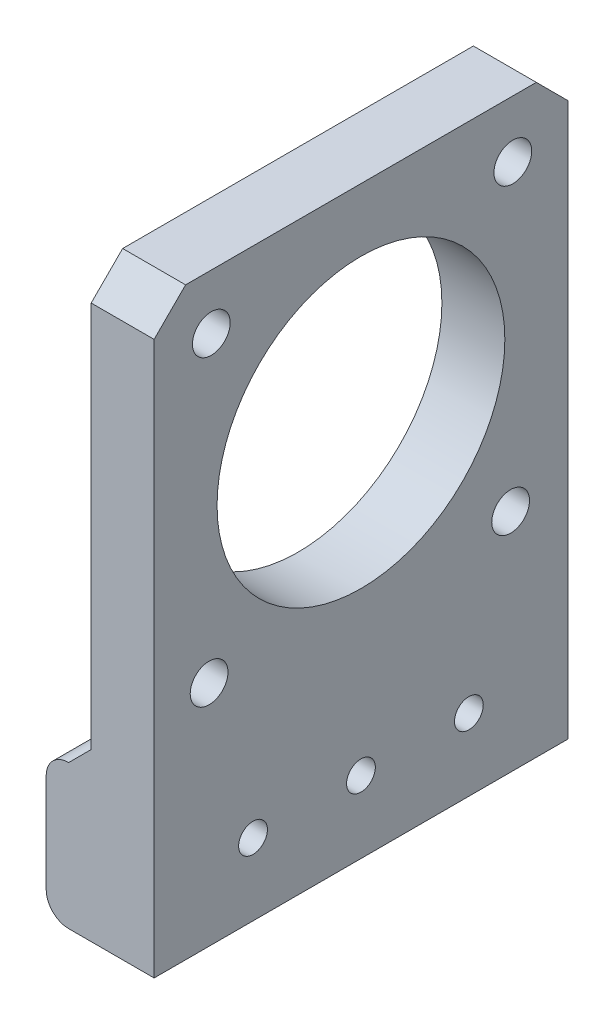
ISO-10303-21;
HEADER;
FILE_DESCRIPTION(('STEP AP214'),'2;1');
FILE_NAME('part.step','',(''),(''),'','','');
FILE_SCHEMA(('AUTOMOTIVE_DESIGN { 1 0 10303 214 1 1 1 1 }'));
ENDSEC;
DATA;
#1=APPLICATION_CONTEXT('core data for automotive mechanical design processes');
#2=APPLICATION_PROTOCOL_DEFINITION('international standard','automotive_design',2000,#1);
#3=PRODUCT_CONTEXT('',#1,'mechanical');
#4=PRODUCT('Part','Part','',(#3));
#5=PRODUCT_RELATED_PRODUCT_CATEGORY('part','',(#4));
#6=PRODUCT_DEFINITION_FORMATION('','',#4);
#7=PRODUCT_DEFINITION_CONTEXT('part definition',#1,'design');
#8=PRODUCT_DEFINITION('design','',#6,#7);
#9=PRODUCT_DEFINITION_SHAPE('','',#8);
#10=(LENGTH_UNIT() NAMED_UNIT(*) SI_UNIT(.MILLI.,.METRE.));
#11=(NAMED_UNIT(*) PLANE_ANGLE_UNIT() SI_UNIT($,.RADIAN.));
#12=(NAMED_UNIT(*) SI_UNIT($,.STERADIAN.) SOLID_ANGLE_UNIT());
#13=UNCERTAINTY_MEASURE_WITH_UNIT(LENGTH_MEASURE(1.E-05),#10,'distance_accuracy_value','');
#14=(GEOMETRIC_REPRESENTATION_CONTEXT(3) GLOBAL_UNCERTAINTY_ASSIGNED_CONTEXT((#13)) GLOBAL_UNIT_ASSIGNED_CONTEXT((#10,
#11,#12)) REPRESENTATION_CONTEXT('',''));
#15=CARTESIAN_POINT('',(0.,0.,0.));
#16=DIRECTION('',(0.,0.,1.));
#17=DIRECTION('',(1.,0.,0.));
#18=AXIS2_PLACEMENT_3D('',#15,#16,#17);
#19=CARTESIAN_POINT('',(-4.99999999999999,2.99999999999996,-23.));
#20=DIRECTION('',(-1.,0.,0.));
#21=DIRECTION('',(0.,0.,1.));
#22=AXIS2_PLACEMENT_3D('',#19,#20,#21);
#23=CYLINDRICAL_SURFACE('',#22,1.59999999999999);
#24=CARTESIAN_POINT('',(-4.99999999999999,2.99999999999996,-23.));
#25=DIRECTION('',(-1.,0.,0.));
#26=DIRECTION('',(0.,0.,1.));
#27=AXIS2_PLACEMENT_3D('',#24,#25,#26);
#28=CIRCLE('',#27,1.6);
#29=CARTESIAN_POINT('',(-4.99999999999999,2.99999999999996,-21.4));
#30=VERTEX_POINT('',#29);
#31=EDGE_CURVE('E148',#30,#30,#28,.T.);
#32=ORIENTED_EDGE('',*,*,#31,.T.);
#33=EDGE_LOOP('',(#32));
#34=FACE_BOUND('',#33,.T.);
#35=CARTESIAN_POINT('',(7.,2.99999999999996,-23.));
#36=DIRECTION('',(1.,0.,0.));
#37=DIRECTION('',(0.,0.,-1.));
#38=AXIS2_PLACEMENT_3D('',#35,#36,#37);
#39=CIRCLE('',#38,1.59999999999999);
#40=CARTESIAN_POINT('',(7.,2.99999999999996,-24.6));
#41=VERTEX_POINT('',#40);
#42=EDGE_CURVE('E12',#41,#41,#39,.F.);
#43=ORIENTED_EDGE('',*,*,#42,.F.);
#44=EDGE_LOOP('',(#43));
#45=FACE_BOUND('',#44,.T.);
#46=ADVANCED_FACE('F38',(#34,#45),#23,.F.);
#47=CARTESIAN_POINT('',(0.,6.,0.));
#48=DIRECTION('',(0.,0.,-1.));
#49=DIRECTION('',(-1.,0.,0.));
#50=AXIS2_PLACEMENT_3D('',#47,#48,#49);
#51=PLANE('',#50);
#52=DIRECTION('',(1.,0.,0.));
#53=VECTOR('',#52,1.);
#54=CARTESIAN_POINT('',(-4.99999999999999,-5.,0.));
#55=LINE('',#54,#53);
#56=CARTESIAN_POINT('',(-2.49999999999999,-5.,0.));
#57=VERTEX_POINT('',#56);
#58=CARTESIAN_POINT('',(7.,-4.99999999999999,0.));
#59=VERTEX_POINT('',#58);
#60=EDGE_CURVE('E145',#57,#59,#55,.T.);
#61=ORIENTED_EDGE('',*,*,#60,.T.);
#62=DIRECTION('',(0.,-1.,0.));
#63=VECTOR('',#62,1.);
#64=CARTESIAN_POINT('',(7.,60.,0.));
#65=LINE('',#64,#63);
#66=CARTESIAN_POINT('',(7.,56.5,0.));
#67=VERTEX_POINT('',#66);
#68=EDGE_CURVE('E55',#67,#59,#65,.T.);
#69=ORIENTED_EDGE('',*,*,#68,.F.);
#70=DIRECTION('',(-1.,0.,0.));
#71=VECTOR('',#70,1.);
#72=CARTESIAN_POINT('',(0.,56.5,0.));
#73=LINE('',#72,#71);
#74=CARTESIAN_POINT('',(0.,56.5,0.));
#75=VERTEX_POINT('',#74);
#76=EDGE_CURVE('E206',#67,#75,#73,.T.);
#77=ORIENTED_EDGE('',*,*,#76,.T.);
#78=DIRECTION('',(0.,-1.,0.));
#79=VECTOR('',#78,1.);
#80=CARTESIAN_POINT('',(0.,6.,0.));
#81=LINE('',#80,#79);
#82=CARTESIAN_POINT('',(0.,13.5,0.));
#83=VERTEX_POINT('',#82);
#84=EDGE_CURVE('E185',#75,#83,#81,.T.);
#85=ORIENTED_EDGE('',*,*,#84,.T.);
#86=DIRECTION('',(-0.707106781186549,-0.707106781186546,0.));
#87=VECTOR('',#86,1.);
#88=CARTESIAN_POINT('',(-3.75,9.75000000000002,0.));
#89=LINE('',#88,#87);
#90=CARTESIAN_POINT('',(-2.5,11.,0.));
#91=VERTEX_POINT('',#90);
#92=EDGE_CURVE('E228',#83,#91,#89,.T.);
#93=ORIENTED_EDGE('',*,*,#92,.T.);
#94=CARTESIAN_POINT('',(-2.5,8.5,0.));
#95=DIRECTION('',(0.,0.,-1.));
#96=DIRECTION('',(-1.,0.,0.));
#97=AXIS2_PLACEMENT_3D('',#94,#95,#96);
#98=CIRCLE('',#97,2.5);
#99=CARTESIAN_POINT('',(-5.,8.5,0.));
#100=VERTEX_POINT('',#99);
#101=EDGE_CURVE('E222',#91,#100,#98,.F.);
#102=ORIENTED_EDGE('',*,*,#101,.T.);
#103=DIRECTION('',(0.,-1.,0.));
#104=VECTOR('',#103,1.);
#105=CARTESIAN_POINT('',(-5.,11.,0.));
#106=LINE('',#105,#104);
#107=CARTESIAN_POINT('',(-4.99999999999999,-2.5,0.));
#108=VERTEX_POINT('',#107);
#109=EDGE_CURVE('E151',#100,#108,#106,.T.);
#110=ORIENTED_EDGE('',*,*,#109,.T.);
#111=CARTESIAN_POINT('',(-2.49999999999999,-2.5,0.));
#112=DIRECTION('',(0.,0.,-1.));
#113=DIRECTION('',(-1.,0.,0.));
#114=AXIS2_PLACEMENT_3D('',#111,#112,#113);
#115=CIRCLE('',#114,2.5);
#116=EDGE_CURVE('E233',#108,#57,#115,.F.);
#117=ORIENTED_EDGE('',*,*,#116,.T.);
#118=EDGE_LOOP('',(#61,#69,#77,#85,#93,#102,#110,#117));
#119=FACE_BOUND('',#118,.T.);
#120=ADVANCED_FACE('F246',(#119),#51,.F.);
#121=CARTESIAN_POINT('',(0.,6.,-46.));
#122=DIRECTION('',(0.,0.,1.));
#123=DIRECTION('',(1.,0.,0.));
#124=AXIS2_PLACEMENT_3D('',#121,#122,#123);
#125=PLANE('',#124);
#126=DIRECTION('',(0.,-1.,0.));
#127=VECTOR('',#126,1.);
#128=CARTESIAN_POINT('',(7.,60.,-46.));
#129=LINE('',#128,#127);
#130=CARTESIAN_POINT('',(7.,56.5,-46.));
#131=VERTEX_POINT('',#130);
#132=CARTESIAN_POINT('',(7.,-4.99999999999999,-46.));
#133=VERTEX_POINT('',#132);
#134=EDGE_CURVE('E119',#131,#133,#129,.T.);
#135=ORIENTED_EDGE('',*,*,#134,.T.);
#136=DIRECTION('',(-1.,0.,0.));
#137=VECTOR('',#136,1.);
#138=CARTESIAN_POINT('',(-4.99999999999999,-5.,-46.));
#139=LINE('',#138,#137);
#140=CARTESIAN_POINT('',(-2.49999999999999,-5.,-46.));
#141=VERTEX_POINT('',#140);
#142=EDGE_CURVE('E122',#133,#141,#139,.T.);
#143=ORIENTED_EDGE('',*,*,#142,.T.);
#144=CARTESIAN_POINT('',(-2.49999999999999,-2.5,-46.));
#145=DIRECTION('',(0.,0.,1.));
#146=DIRECTION('',(1.,0.,0.));
#147=AXIS2_PLACEMENT_3D('',#144,#145,#146);
#148=CIRCLE('',#147,2.5);
#149=CARTESIAN_POINT('',(-4.99999999999999,-2.5,-46.));
#150=VERTEX_POINT('',#149);
#151=EDGE_CURVE('E231',#141,#150,#148,.F.);
#152=ORIENTED_EDGE('',*,*,#151,.T.);
#153=DIRECTION('',(0.,1.,0.));
#154=VECTOR('',#153,1.);
#155=CARTESIAN_POINT('',(-5.,11.,-46.));
#156=LINE('',#155,#154);
#157=CARTESIAN_POINT('',(-5.,8.5,-46.));
#158=VERTEX_POINT('',#157);
#159=EDGE_CURVE('E142',#150,#158,#156,.T.);
#160=ORIENTED_EDGE('',*,*,#159,.T.);
#161=CARTESIAN_POINT('',(-2.5,8.5,-46.));
#162=DIRECTION('',(0.,0.,1.));
#163=DIRECTION('',(1.,0.,0.));
#164=AXIS2_PLACEMENT_3D('',#161,#162,#163);
#165=CIRCLE('',#164,2.5);
#166=CARTESIAN_POINT('',(-2.5,11.,-46.));
#167=VERTEX_POINT('',#166);
#168=EDGE_CURVE('E216',#158,#167,#165,.F.);
#169=ORIENTED_EDGE('',*,*,#168,.T.);
#170=DIRECTION('',(0.707106781186549,0.707106781186546,0.));
#171=VECTOR('',#170,1.);
#172=CARTESIAN_POINT('',(-3.75,9.75000000000002,-46.));
#173=LINE('',#172,#171);
#174=CARTESIAN_POINT('',(0.,13.5,-46.));
#175=VERTEX_POINT('',#174);
#176=EDGE_CURVE('E226',#167,#175,#173,.T.);
#177=ORIENTED_EDGE('',*,*,#176,.T.);
#178=DIRECTION('',(0.,-1.,0.));
#179=VECTOR('',#178,1.);
#180=CARTESIAN_POINT('',(0.,6.,-46.));
#181=LINE('',#180,#179);
#182=CARTESIAN_POINT('',(0.,56.5,-46.));
#183=VERTEX_POINT('',#182);
#184=EDGE_CURVE('E182',#183,#175,#181,.T.);
#185=ORIENTED_EDGE('',*,*,#184,.F.);
#186=DIRECTION('',(1.,0.,0.));
#187=VECTOR('',#186,1.);
#188=CARTESIAN_POINT('',(7.,56.5,-46.));
#189=LINE('',#188,#187);
#190=EDGE_CURVE('E126',#183,#131,#189,.T.);
#191=ORIENTED_EDGE('',*,*,#190,.T.);
#192=EDGE_LOOP('',(#135,#143,#152,#160,#169,#177,#185,#191));
#193=FACE_BOUND('',#192,.T.);
#194=ADVANCED_FACE('F120',(#193),#125,.F.);
#195=CARTESIAN_POINT('',(-4.99999999999999,-5.,22.6274169979695));
#196=DIRECTION('',(0.,-1.,0.));
#197=DIRECTION('',(1.,0.,0.));
#198=AXIS2_PLACEMENT_3D('',#195,#196,#197);
#199=PLANE('',#198);
#200=ORIENTED_EDGE('',*,*,#142,.F.);
#201=DIRECTION('',(0.,0.,1.));
#202=VECTOR('',#201,1.);
#203=CARTESIAN_POINT('',(7.,-4.99999999999999,22.6274169979695));
#204=LINE('',#203,#202);
#205=EDGE_CURVE('E130',#133,#59,#204,.T.);
#206=ORIENTED_EDGE('',*,*,#205,.T.);
#207=ORIENTED_EDGE('',*,*,#60,.F.);
#208=DIRECTION('',(0.,0.,-1.));
#209=VECTOR('',#208,1.);
#210=CARTESIAN_POINT('',(-2.49999999999999,-5.,22.6274169979695));
#211=LINE('',#210,#209);
#212=EDGE_CURVE('E141',#57,#141,#211,.T.);
#213=ORIENTED_EDGE('',*,*,#212,.T.);
#214=EDGE_LOOP('',(#200,#206,#207,#213));
#215=FACE_BOUND('',#214,.T.);
#216=ADVANCED_FACE('F139',(#215),#199,.T.);
#217=CARTESIAN_POINT('',(-4.99999999999999,2.99999999999997,-35.));
#218=DIRECTION('',(-1.,0.,0.));
#219=DIRECTION('',(0.,0.,1.));
#220=AXIS2_PLACEMENT_3D('',#217,#218,#219);
#221=CYLINDRICAL_SURFACE('',#220,1.59999999999999);
#222=CARTESIAN_POINT('',(-4.99999999999999,2.99999999999997,-35.));
#223=DIRECTION('',(-1.,0.,0.));
#224=DIRECTION('',(0.,0.,1.));
#225=AXIS2_PLACEMENT_3D('',#222,#223,#224);
#226=CIRCLE('',#225,1.6);
#227=CARTESIAN_POINT('',(-4.99999999999999,2.99999999999997,-33.4));
#228=VERTEX_POINT('',#227);
#229=EDGE_CURVE('E143',#228,#228,#226,.T.);
#230=ORIENTED_EDGE('',*,*,#229,.T.);
#231=EDGE_LOOP('',(#230));
#232=FACE_BOUND('',#231,.T.);
#233=CARTESIAN_POINT('',(7.,2.99999999999997,-35.));
#234=DIRECTION('',(1.,0.,0.));
#235=DIRECTION('',(0.,0.,-1.));
#236=AXIS2_PLACEMENT_3D('',#233,#234,#235);
#237=CIRCLE('',#236,1.59999999999999);
#238=CARTESIAN_POINT('',(7.,2.99999999999997,-36.6));
#239=VERTEX_POINT('',#238);
#240=EDGE_CURVE('E47',#239,#239,#237,.F.);
#241=ORIENTED_EDGE('',*,*,#240,.F.);
#242=EDGE_LOOP('',(#241));
#243=FACE_BOUND('',#242,.T.);
#244=ADVANCED_FACE('F297',(#232,#243),#221,.F.);
#245=CARTESIAN_POINT('',(-4.99999999999999,2.99999999999997,-11.));
#246=DIRECTION('',(-1.,0.,0.));
#247=DIRECTION('',(0.,0.,1.));
#248=AXIS2_PLACEMENT_3D('',#245,#246,#247);
#249=CYLINDRICAL_SURFACE('',#248,1.59999999999999);
#250=CARTESIAN_POINT('',(-4.99999999999999,2.99999999999997,-11.));
#251=DIRECTION('',(-1.,0.,0.));
#252=DIRECTION('',(0.,0.,1.));
#253=AXIS2_PLACEMENT_3D('',#250,#251,#252);
#254=CIRCLE('',#253,1.6);
#255=CARTESIAN_POINT('',(-4.99999999999999,2.99999999999997,-9.4));
#256=VERTEX_POINT('',#255);
#257=EDGE_CURVE('E136',#256,#256,#254,.T.);
#258=ORIENTED_EDGE('',*,*,#257,.T.);
#259=EDGE_LOOP('',(#258));
#260=FACE_BOUND('',#259,.T.);
#261=CARTESIAN_POINT('',(7.,2.99999999999997,-11.));
#262=DIRECTION('',(1.,0.,0.));
#263=DIRECTION('',(0.,0.,-1.));
#264=AXIS2_PLACEMENT_3D('',#261,#262,#263);
#265=CIRCLE('',#264,1.59999999999999);
#266=CARTESIAN_POINT('',(7.,2.99999999999997,-12.6));
#267=VERTEX_POINT('',#266);
#268=EDGE_CURVE('E42',#267,#267,#265,.F.);
#269=ORIENTED_EDGE('',*,*,#268,.F.);
#270=EDGE_LOOP('',(#269));
#271=FACE_BOUND('',#270,.T.);
#272=ADVANCED_FACE('F296',(#260,#271),#249,.F.);
#273=CARTESIAN_POINT('',(0.,6.,0.));
#274=DIRECTION('',(1.,0.,0.));
#275=DIRECTION('',(0.,0.,-1.));
#276=AXIS2_PLACEMENT_3D('',#273,#274,#275);
#277=PLANE('',#276);
#278=CARTESIAN_POINT('',(0.,53.6420790678196,-39.8856216883262));
#279=DIRECTION('',(-1.,0.,0.));
#280=DIRECTION('',(0.,0.,1.));
#281=AXIS2_PLACEMENT_3D('',#278,#279,#280);
#282=CIRCLE('',#281,2.09999999999999);
#283=CARTESIAN_POINT('',(0.,53.6420790678196,-37.7856216883262));
#284=VERTEX_POINT('',#283);
#285=EDGE_CURVE('E154',#284,#284,#282,.T.);
#286=ORIENTED_EDGE('',*,*,#285,.F.);
#287=EDGE_LOOP('',(#286));
#288=FACE_BOUND('',#287,.T.);
#289=CARTESIAN_POINT('',(0.,53.8856216883252,-6.35792093218061));
#290=DIRECTION('',(-1.,0.,0.));
#291=DIRECTION('',(0.,0.,1.));
#292=AXIS2_PLACEMENT_3D('',#289,#290,#291);
#293=CIRCLE('',#292,2.09999999999999);
#294=CARTESIAN_POINT('',(0.,53.8856216883252,-4.25792093218062));
#295=VERTEX_POINT('',#294);
#296=EDGE_CURVE('E158',#295,#295,#293,.T.);
#297=ORIENTED_EDGE('',*,*,#296,.F.);
#298=EDGE_LOOP('',(#297));
#299=FACE_BOUND('',#298,.T.);
#300=CARTESIAN_POINT('',(0.,20.3579209321799,-6.11437831167505));
#301=DIRECTION('',(-1.,0.,0.));
#302=DIRECTION('',(0.,0.,1.));
#303=AXIS2_PLACEMENT_3D('',#300,#301,#302);
#304=CIRCLE('',#303,2.09999999999999);
#305=CARTESIAN_POINT('',(0.,20.3579209321799,-4.01437831167506));
#306=VERTEX_POINT('',#305);
#307=EDGE_CURVE('E164',#306,#306,#304,.T.);
#308=ORIENTED_EDGE('',*,*,#307,.F.);
#309=EDGE_LOOP('',(#308));
#310=FACE_BOUND('',#309,.T.);
#311=CARTESIAN_POINT('',(0.,20.114378311674,-39.6420790678205));
#312=DIRECTION('',(-1.,0.,0.));
#313=DIRECTION('',(0.,0.,1.));
#314=AXIS2_PLACEMENT_3D('',#311,#312,#313);
#315=CIRCLE('',#314,2.09999999999999);
#316=CARTESIAN_POINT('',(0.,20.114378311674,-37.5420790678205));
#317=VERTEX_POINT('',#316);
#318=EDGE_CURVE('E168',#317,#317,#315,.T.);
#319=ORIENTED_EDGE('',*,*,#318,.F.);
#320=EDGE_LOOP('',(#319));
#321=FACE_BOUND('',#320,.T.);
#322=CARTESIAN_POINT('',(0.,37.,-23.));
#323=DIRECTION('',(1.,0.,0.));
#324=DIRECTION('',(0.,0.,-1.));
#325=AXIS2_PLACEMENT_3D('',#322,#323,#324);
#326=CIRCLE('',#325,16.);
#327=CARTESIAN_POINT('',(0.,37.,-39.));
#328=VERTEX_POINT('',#327);
#329=EDGE_CURVE('E172',#328,#328,#326,.T.);
#330=ORIENTED_EDGE('',*,*,#329,.T.);
#331=EDGE_LOOP('',(#330));
#332=FACE_BOUND('',#331,.T.);
#333=ORIENTED_EDGE('',*,*,#184,.T.);
#334=DIRECTION('',(0.,0.,1.));
#335=VECTOR('',#334,1.);
#336=CARTESIAN_POINT('',(0.,13.5,0.));
#337=LINE('',#336,#335);
#338=EDGE_CURVE('E224',#175,#83,#337,.T.);
#339=ORIENTED_EDGE('',*,*,#338,.T.);
#340=ORIENTED_EDGE('',*,*,#84,.F.);
#341=DIRECTION('',(0.,0.707106781186549,-0.707106781186546));
#342=VECTOR('',#341,1.);
#343=CARTESIAN_POINT('',(0.,60.,-3.5));
#344=LINE('',#343,#342);
#345=CARTESIAN_POINT('',(0.,60.,-3.5));
#346=VERTEX_POINT('',#345);
#347=EDGE_CURVE('E210',#75,#346,#344,.T.);
#348=ORIENTED_EDGE('',*,*,#347,.T.);
#349=DIRECTION('',(0.,0.,1.));
#350=VECTOR('',#349,1.);
#351=CARTESIAN_POINT('',(0.,60.,-46.));
#352=LINE('',#351,#350);
#353=CARTESIAN_POINT('',(0.,60.,-42.5));
#354=VERTEX_POINT('',#353);
#355=EDGE_CURVE('E176',#354,#346,#352,.T.);
#356=ORIENTED_EDGE('',*,*,#355,.F.);
#357=DIRECTION('',(0.,-0.707106781186549,-0.707106781186546));
#358=VECTOR('',#357,1.);
#359=CARTESIAN_POINT('',(0.,60.,-42.5));
#360=LINE('',#359,#358);
#361=EDGE_CURVE('E208',#354,#183,#360,.T.);
#362=ORIENTED_EDGE('',*,*,#361,.T.);
#363=EDGE_LOOP('',(#333,#339,#340,#348,#356,#362));
#364=FACE_BOUND('',#363,.T.);
#365=ADVANCED_FACE('F258',(#288,#299,#310,#321,#332,#364),#277,.F.);
#366=CARTESIAN_POINT('',(7.,60.,-46.));
#367=DIRECTION('',(-1.,0.,0.));
#368=DIRECTION('',(0.,0.,1.));
#369=AXIS2_PLACEMENT_3D('',#366,#367,#368);
#370=PLANE('',#369);
#371=CARTESIAN_POINT('',(7.,53.6420790678196,-39.8856216883262));
#372=DIRECTION('',(-1.,0.,0.));
#373=DIRECTION('',(0.,0.,1.));
#374=AXIS2_PLACEMENT_3D('',#371,#372,#373);
#375=CIRCLE('',#374,2.09999999999998);
#376=CARTESIAN_POINT('',(7.,53.6420790678196,-37.7856216883262));
#377=VERTEX_POINT('',#376);
#378=EDGE_CURVE('E157',#377,#377,#375,.T.);
#379=ORIENTED_EDGE('',*,*,#378,.T.);
#380=EDGE_LOOP('',(#379));
#381=FACE_BOUND('',#380,.T.);
#382=CARTESIAN_POINT('',(7.,53.8856216883252,-6.35792093218061));
#383=DIRECTION('',(-1.,0.,0.));
#384=DIRECTION('',(0.,0.,1.));
#385=AXIS2_PLACEMENT_3D('',#382,#383,#384);
#386=CIRCLE('',#385,2.09999999999998);
#387=CARTESIAN_POINT('',(7.,53.8856216883252,-4.25792093218062));
#388=VERTEX_POINT('',#387);
#389=EDGE_CURVE('E161',#388,#388,#386,.T.);
#390=ORIENTED_EDGE('',*,*,#389,.T.);
#391=EDGE_LOOP('',(#390));
#392=FACE_BOUND('',#391,.T.);
#393=CARTESIAN_POINT('',(7.,20.3579209321799,-6.11437831167505));
#394=DIRECTION('',(-1.,0.,0.));
#395=DIRECTION('',(0.,0.,1.));
#396=AXIS2_PLACEMENT_3D('',#393,#394,#395);
#397=CIRCLE('',#396,2.09999999999998);
#398=CARTESIAN_POINT('',(7.,20.3579209321799,-4.01437831167506));
#399=VERTEX_POINT('',#398);
#400=EDGE_CURVE('E167',#399,#399,#397,.T.);
#401=ORIENTED_EDGE('',*,*,#400,.T.);
#402=EDGE_LOOP('',(#401));
#403=FACE_BOUND('',#402,.T.);
#404=CARTESIAN_POINT('',(7.,20.114378311674,-39.6420790678205));
#405=DIRECTION('',(-1.,0.,0.));
#406=DIRECTION('',(0.,0.,1.));
#407=AXIS2_PLACEMENT_3D('',#404,#405,#406);
#408=CIRCLE('',#407,2.09999999999998);
#409=CARTESIAN_POINT('',(7.,20.114378311674,-37.5420790678205));
#410=VERTEX_POINT('',#409);
#411=EDGE_CURVE('E171',#410,#410,#408,.T.);
#412=ORIENTED_EDGE('',*,*,#411,.T.);
#413=EDGE_LOOP('',(#412));
#414=FACE_BOUND('',#413,.T.);
#415=CARTESIAN_POINT('',(7.,37.,-23.));
#416=DIRECTION('',(-1.,0.,0.));
#417=DIRECTION('',(0.,0.,1.));
#418=AXIS2_PLACEMENT_3D('',#415,#416,#417);
#419=CIRCLE('',#418,16.);
#420=CARTESIAN_POINT('',(7.,37.,-6.99999999999999));
#421=VERTEX_POINT('',#420);
#422=EDGE_CURVE('E175',#421,#421,#419,.T.);
#423=ORIENTED_EDGE('',*,*,#422,.T.);
#424=EDGE_LOOP('',(#423));
#425=FACE_BOUND('',#424,.T.);
#426=ORIENTED_EDGE('',*,*,#68,.T.);
#427=ORIENTED_EDGE('',*,*,#205,.F.);
#428=ORIENTED_EDGE('',*,*,#134,.F.);
#429=DIRECTION('',(0.,0.707106781186549,0.707106781186546));
#430=VECTOR('',#429,1.);
#431=CARTESIAN_POINT('',(7.,60.,-42.5));
#432=LINE('',#431,#430);
#433=CARTESIAN_POINT('',(7.,60.,-42.5));
#434=VERTEX_POINT('',#433);
#435=EDGE_CURVE('E202',#131,#434,#432,.T.);
#436=ORIENTED_EDGE('',*,*,#435,.T.);
#437=DIRECTION('',(0.,0.,-1.));
#438=VECTOR('',#437,1.);
#439=CARTESIAN_POINT('',(7.,60.,-46.));
#440=LINE('',#439,#438);
#441=CARTESIAN_POINT('',(7.,60.,-3.5));
#442=VERTEX_POINT('',#441);
#443=EDGE_CURVE('E128',#442,#434,#440,.T.);
#444=ORIENTED_EDGE('',*,*,#443,.F.);
#445=DIRECTION('',(0.,-0.707106781186549,0.707106781186546));
#446=VECTOR('',#445,1.);
#447=CARTESIAN_POINT('',(7.,60.,-3.5));
#448=LINE('',#447,#446);
#449=EDGE_CURVE('E204',#442,#67,#448,.T.);
#450=ORIENTED_EDGE('',*,*,#449,.T.);
#451=EDGE_LOOP('',(#426,#427,#428,#436,#444,#450));
#452=FACE_BOUND('',#451,.T.);
#453=ORIENTED_EDGE('',*,*,#240,.T.);
#454=EDGE_LOOP('',(#453));
#455=FACE_BOUND('',#454,.T.);
#456=ORIENTED_EDGE('',*,*,#268,.T.);
#457=EDGE_LOOP('',(#456));
#458=FACE_BOUND('',#457,.T.);
#459=ORIENTED_EDGE('',*,*,#42,.T.);
#460=EDGE_LOOP('',(#459));
#461=FACE_BOUND('',#460,.T.);
#462=ADVANCED_FACE('F131',(#381,#392,#403,#414,#425,#452,#455,#458,#461),#370,.F.);
#463=CARTESIAN_POINT('',(0.,60.,0.));
#464=DIRECTION('',(0.,1.,0.));
#465=DIRECTION('',(0.,0.,1.));
#466=AXIS2_PLACEMENT_3D('',#463,#464,#465);
#467=PLANE('',#466);
#468=ORIENTED_EDGE('',*,*,#355,.T.);
#469=DIRECTION('',(1.,0.,0.));
#470=VECTOR('',#469,1.);
#471=CARTESIAN_POINT('',(7.,60.,-3.5));
#472=LINE('',#471,#470);
#473=EDGE_CURVE('E199',#346,#442,#472,.T.);
#474=ORIENTED_EDGE('',*,*,#473,.T.);
#475=ORIENTED_EDGE('',*,*,#443,.T.);
#476=DIRECTION('',(-1.,0.,0.));
#477=VECTOR('',#476,1.);
#478=CARTESIAN_POINT('',(0.,60.,-42.5));
#479=LINE('',#478,#477);
#480=EDGE_CURVE('E188',#434,#354,#479,.T.);
#481=ORIENTED_EDGE('',*,*,#480,.T.);
#482=EDGE_LOOP('',(#468,#474,#475,#481));
#483=FACE_BOUND('',#482,.T.);
#484=ADVANCED_FACE('F270',(#483),#467,.T.);
#485=CARTESIAN_POINT('',(0.,37.,-23.));
#486=DIRECTION('',(1.,0.,0.));
#487=DIRECTION('',(0.,0.,-1.));
#488=AXIS2_PLACEMENT_3D('',#485,#486,#487);
#489=CYLINDRICAL_SURFACE('',#488,16.);
#490=ORIENTED_EDGE('',*,*,#329,.F.);
#491=EDGE_LOOP('',(#490));
#492=FACE_BOUND('',#491,.T.);
#493=ORIENTED_EDGE('',*,*,#422,.F.);
#494=EDGE_LOOP('',(#493));
#495=FACE_BOUND('',#494,.T.);
#496=ADVANCED_FACE('F317',(#492,#495),#489,.F.);
#497=CARTESIAN_POINT('',(0.,20.114378311674,-39.6420790678205));
#498=DIRECTION('',(-1.,0.,0.));
#499=DIRECTION('',(0.,0.,1.));
#500=AXIS2_PLACEMENT_3D('',#497,#498,#499);
#501=CYLINDRICAL_SURFACE('',#500,2.09999999999998);
#502=ORIENTED_EDGE('',*,*,#318,.T.);
#503=EDGE_LOOP('',(#502));
#504=FACE_BOUND('',#503,.T.);
#505=ORIENTED_EDGE('',*,*,#411,.F.);
#506=EDGE_LOOP('',(#505));
#507=FACE_BOUND('',#506,.T.);
#508=ADVANCED_FACE('F313',(#504,#507),#501,.F.);
#509=CARTESIAN_POINT('',(0.,20.3579209321799,-6.11437831167505));
#510=DIRECTION('',(-1.,0.,0.));
#511=DIRECTION('',(0.,0.,1.));
#512=AXIS2_PLACEMENT_3D('',#509,#510,#511);
#513=CYLINDRICAL_SURFACE('',#512,2.09999999999998);
#514=ORIENTED_EDGE('',*,*,#307,.T.);
#515=EDGE_LOOP('',(#514));
#516=FACE_BOUND('',#515,.T.);
#517=ORIENTED_EDGE('',*,*,#400,.F.);
#518=EDGE_LOOP('',(#517));
#519=FACE_BOUND('',#518,.T.);
#520=ADVANCED_FACE('F309',(#516,#519),#513,.F.);
#521=CARTESIAN_POINT('',(0.,53.8856216883252,-6.35792093218061));
#522=DIRECTION('',(-1.,0.,0.));
#523=DIRECTION('',(0.,0.,1.));
#524=AXIS2_PLACEMENT_3D('',#521,#522,#523);
#525=CYLINDRICAL_SURFACE('',#524,2.09999999999998);
#526=ORIENTED_EDGE('',*,*,#296,.T.);
#527=EDGE_LOOP('',(#526));
#528=FACE_BOUND('',#527,.T.);
#529=ORIENTED_EDGE('',*,*,#389,.F.);
#530=EDGE_LOOP('',(#529));
#531=FACE_BOUND('',#530,.T.);
#532=ADVANCED_FACE('F305',(#528,#531),#525,.F.);
#533=CARTESIAN_POINT('',(0.,53.6420790678196,-39.8856216883262));
#534=DIRECTION('',(-1.,0.,0.));
#535=DIRECTION('',(0.,0.,1.));
#536=AXIS2_PLACEMENT_3D('',#533,#534,#535);
#537=CYLINDRICAL_SURFACE('',#536,2.09999999999998);
#538=ORIENTED_EDGE('',*,*,#285,.T.);
#539=EDGE_LOOP('',(#538));
#540=FACE_BOUND('',#539,.T.);
#541=ORIENTED_EDGE('',*,*,#378,.F.);
#542=EDGE_LOOP('',(#541));
#543=FACE_BOUND('',#542,.T.);
#544=ADVANCED_FACE('F282',(#540,#543),#537,.F.);
#545=CARTESIAN_POINT('',(0.,60.,-3.5));
#546=DIRECTION('',(0.,0.707106781186546,0.707106781186549));
#547=DIRECTION('',(-1.,0.,0.));
#548=AXIS2_PLACEMENT_3D('',#545,#546,#547);
#549=PLANE('',#548);
#550=ORIENTED_EDGE('',*,*,#347,.F.);
#551=ORIENTED_EDGE('',*,*,#76,.F.);
#552=ORIENTED_EDGE('',*,*,#449,.F.);
#553=ORIENTED_EDGE('',*,*,#473,.F.);
#554=EDGE_LOOP('',(#550,#551,#552,#553));
#555=FACE_BOUND('',#554,.T.);
#556=ADVANCED_FACE('F267',(#555),#549,.T.);
#557=CARTESIAN_POINT('',(0.,60.,-42.5));
#558=DIRECTION('',(0.,0.707106781186546,-0.707106781186549));
#559=DIRECTION('',(1.,0.,0.));
#560=AXIS2_PLACEMENT_3D('',#557,#558,#559);
#561=PLANE('',#560);
#562=ORIENTED_EDGE('',*,*,#435,.F.);
#563=ORIENTED_EDGE('',*,*,#190,.F.);
#564=ORIENTED_EDGE('',*,*,#361,.F.);
#565=ORIENTED_EDGE('',*,*,#480,.F.);
#566=EDGE_LOOP('',(#562,#563,#564,#565));
#567=FACE_BOUND('',#566,.T.);
#568=ADVANCED_FACE('F273',(#567),#561,.T.);
#569=CARTESIAN_POINT('',(-5.,11.,22.6274169979695));
#570=DIRECTION('',(-1.,0.,0.));
#571=DIRECTION('',(0.,-1.,0.));
#572=AXIS2_PLACEMENT_3D('',#569,#570,#571);
#573=PLANE('',#572);
#574=ORIENTED_EDGE('',*,*,#257,.F.);
#575=EDGE_LOOP('',(#574));
#576=FACE_BOUND('',#575,.T.);
#577=ORIENTED_EDGE('',*,*,#31,.F.);
#578=EDGE_LOOP('',(#577));
#579=FACE_BOUND('',#578,.T.);
#580=ORIENTED_EDGE('',*,*,#229,.F.);
#581=EDGE_LOOP('',(#580));
#582=FACE_BOUND('',#581,.T.);
#583=ORIENTED_EDGE('',*,*,#159,.F.);
#584=DIRECTION('',(0.,0.,-1.));
#585=VECTOR('',#584,1.);
#586=CARTESIAN_POINT('',(-4.99999999999999,-2.5,22.6274169979695));
#587=LINE('',#586,#585);
#588=EDGE_CURVE('E63',#150,#108,#587,.F.);
#589=ORIENTED_EDGE('',*,*,#588,.T.);
#590=ORIENTED_EDGE('',*,*,#109,.F.);
#591=DIRECTION('',(0.,0.,-1.));
#592=VECTOR('',#591,1.);
#593=CARTESIAN_POINT('',(-5.,8.5,22.6274169979695));
#594=LINE('',#593,#592);
#595=EDGE_CURVE('E213',#100,#158,#594,.T.);
#596=ORIENTED_EDGE('',*,*,#595,.T.);
#597=EDGE_LOOP('',(#583,#589,#590,#596));
#598=FACE_BOUND('',#597,.T.);
#599=ADVANCED_FACE('F251',(#576,#579,#582,#598),#573,.T.);
#600=CARTESIAN_POINT('',(-2.5,8.5,22.6274169979695));
#601=DIRECTION('',(0.,0.,-1.));
#602=DIRECTION('',(-1.,0.,0.));
#603=AXIS2_PLACEMENT_3D('',#600,#601,#602);
#604=CYLINDRICAL_SURFACE('',#603,2.5);
#605=ORIENTED_EDGE('',*,*,#101,.F.);
#606=DIRECTION('',(0.,0.,-1.));
#607=VECTOR('',#606,1.);
#608=CARTESIAN_POINT('',(-2.5,11.,22.6274169979695));
#609=LINE('',#608,#607);
#610=EDGE_CURVE('E219',#167,#91,#609,.F.);
#611=ORIENTED_EDGE('',*,*,#610,.F.);
#612=ORIENTED_EDGE('',*,*,#168,.F.);
#613=ORIENTED_EDGE('',*,*,#595,.F.);
#614=EDGE_LOOP('',(#605,#611,#612,#613));
#615=FACE_BOUND('',#614,.T.);
#616=ADVANCED_FACE('F253',(#615),#604,.T.);
#617=CARTESIAN_POINT('',(-2.50000000000002,11.,22.6274169979695));
#618=DIRECTION('',(0.707106781186545,-0.707106781186549,0.));
#619=DIRECTION('',(0.,0.,-1.));
#620=AXIS2_PLACEMENT_3D('',#617,#618,#619);
#621=PLANE('',#620);
#622=ORIENTED_EDGE('',*,*,#92,.F.);
#623=ORIENTED_EDGE('',*,*,#338,.F.);
#624=ORIENTED_EDGE('',*,*,#176,.F.);
#625=ORIENTED_EDGE('',*,*,#610,.T.);
#626=EDGE_LOOP('',(#622,#623,#624,#625));
#627=FACE_BOUND('',#626,.T.);
#628=ADVANCED_FACE('F262',(#627),#621,.F.);
#629=CARTESIAN_POINT('',(-2.49999999999999,-2.5,22.6274169979695));
#630=DIRECTION('',(0.,0.,-1.));
#631=DIRECTION('',(-1.,0.,0.));
#632=AXIS2_PLACEMENT_3D('',#629,#630,#631);
#633=CYLINDRICAL_SURFACE('',#632,2.5);
#634=ORIENTED_EDGE('',*,*,#116,.F.);
#635=ORIENTED_EDGE('',*,*,#588,.F.);
#636=ORIENTED_EDGE('',*,*,#151,.F.);
#637=ORIENTED_EDGE('',*,*,#212,.F.);
#638=EDGE_LOOP('',(#634,#635,#636,#637));
#639=FACE_BOUND('',#638,.T.);
#640=ADVANCED_FACE('F40',(#639),#633,.T.);
#641=CLOSED_SHELL('',(#46,#120,#194,#216,#244,#272,#365,#462,#484,#496,#508,#520,#532,#544,#556,
#568,#599,#616,#628,#640));
#642=MANIFOLD_SOLID_BREP('B2',#641);
#643=ADVANCED_BREP_SHAPE_REPRESENTATION('',(#18,#642),#14);
#644=SHAPE_DEFINITION_REPRESENTATION(#9,#643);
ENDSEC;
END-ISO-10303-21;
